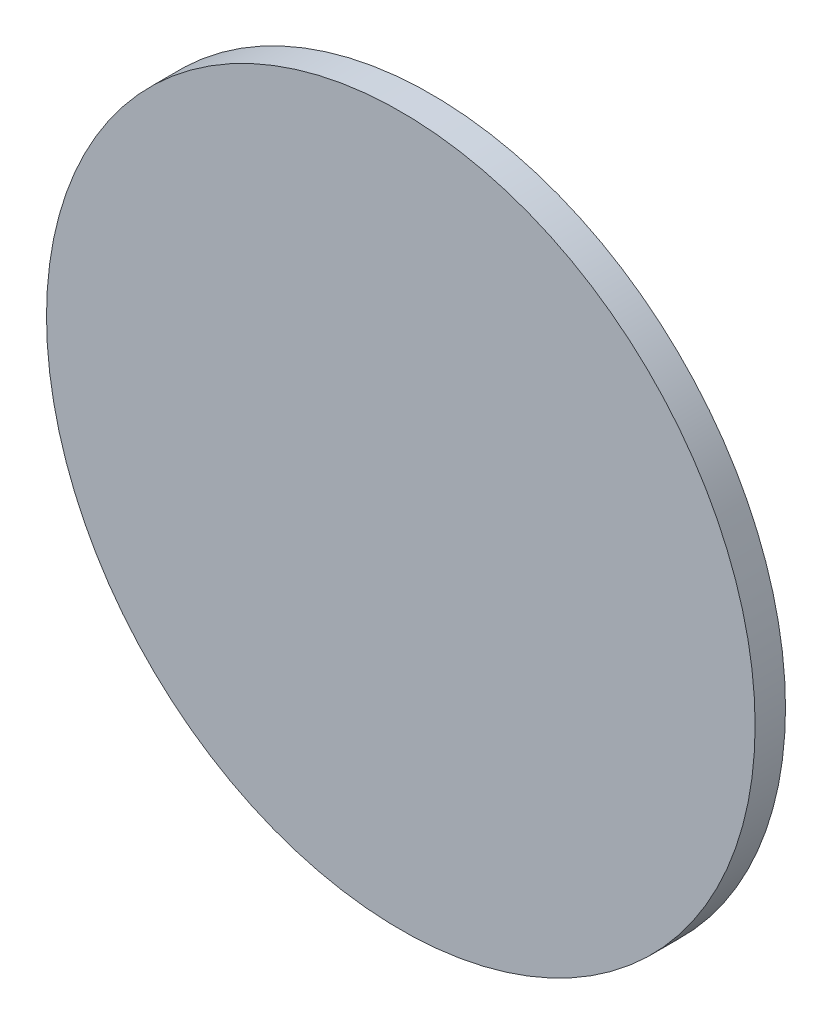
ISO-10303-21;
HEADER;
FILE_DESCRIPTION(('STEP AP214'),'2;1');
FILE_NAME('part.step','',(''),(''),'','','');
FILE_SCHEMA(('AUTOMOTIVE_DESIGN { 1 0 10303 214 1 1 1 1 }'));
ENDSEC;
DATA;
#1=APPLICATION_CONTEXT('core data for automotive mechanical design processes');
#2=APPLICATION_PROTOCOL_DEFINITION('international standard','automotive_design',2000,#1);
#3=PRODUCT_CONTEXT('',#1,'mechanical');
#4=PRODUCT('Part','Part','',(#3));
#5=PRODUCT_RELATED_PRODUCT_CATEGORY('part','',(#4));
#6=PRODUCT_DEFINITION_FORMATION('','',#4);
#7=PRODUCT_DEFINITION_CONTEXT('part definition',#1,'design');
#8=PRODUCT_DEFINITION('design','',#6,#7);
#9=PRODUCT_DEFINITION_SHAPE('','',#8);
#10=(LENGTH_UNIT() NAMED_UNIT(*) SI_UNIT(.MILLI.,.METRE.));
#11=(NAMED_UNIT(*) PLANE_ANGLE_UNIT() SI_UNIT($,.RADIAN.));
#12=(NAMED_UNIT(*) SI_UNIT($,.STERADIAN.) SOLID_ANGLE_UNIT());
#13=UNCERTAINTY_MEASURE_WITH_UNIT(LENGTH_MEASURE(1.E-05),#10,'distance_accuracy_value','');
#14=(GEOMETRIC_REPRESENTATION_CONTEXT(3) GLOBAL_UNCERTAINTY_ASSIGNED_CONTEXT((#13)) GLOBAL_UNIT_ASSIGNED_CONTEXT((#10,
#11,#12)) REPRESENTATION_CONTEXT('',''));
#15=CARTESIAN_POINT('',(0.,0.,0.));
#16=DIRECTION('',(0.,0.,1.));
#17=DIRECTION('',(1.,0.,0.));
#18=AXIS2_PLACEMENT_3D('',#15,#16,#17);
#19=CARTESIAN_POINT('',(0.,0.,3.81));
#20=DIRECTION('',(0.,0.,-1.));
#21=DIRECTION('',(-1.,0.,0.));
#22=AXIS2_PLACEMENT_3D('',#19,#20,#21);
#23=CYLINDRICAL_SURFACE('',#22,44.45);
#24=CARTESIAN_POINT('',(0.,0.,3.81));
#25=DIRECTION('',(0.,0.,1.));
#26=DIRECTION('',(1.,0.,0.));
#27=AXIS2_PLACEMENT_3D('',#24,#25,#26);
#28=CIRCLE('',#27,44.45);
#29=CARTESIAN_POINT('',(-44.45,0.,3.81));
#30=VERTEX_POINT('',#29);
#31=EDGE_CURVE('E10',#30,#30,#28,.T.);
#32=CARTESIAN_POINT('',(0.,0.,0.));
#33=DIRECTION('',(0.,0.,1.));
#34=DIRECTION('',(1.,0.,0.));
#35=AXIS2_PLACEMENT_3D('',#32,#33,#34);
#36=CIRCLE('',#35,44.45);
#37=CARTESIAN_POINT('',(-44.45,0.,0.));
#38=VERTEX_POINT('',#37);
#39=EDGE_CURVE('E36',#38,#38,#36,.T.);
#40=CARTESIAN_POINT('',(-44.45,0.,3.81));
#41=CARTESIAN_POINT('',(-44.45,0.,3.7703125));
#42=CARTESIAN_POINT('',(-44.45,0.,3.730625));
#43=CARTESIAN_POINT('',(-44.45,0.,3.65125));
#44=CARTESIAN_POINT('',(-44.45,0.,3.6115625));
#45=CARTESIAN_POINT('',(-44.45,0.,3.5321875));
#46=CARTESIAN_POINT('',(-44.45,0.,3.4925));
#47=CARTESIAN_POINT('',(-44.45,0.,3.413125));
#48=CARTESIAN_POINT('',(-44.45,0.,3.3734375));
#49=CARTESIAN_POINT('',(-44.45,0.,3.2940625));
#50=CARTESIAN_POINT('',(-44.45,0.,3.254375));
#51=CARTESIAN_POINT('',(-44.45,0.,3.175));
#52=CARTESIAN_POINT('',(-44.45,0.,3.1353125));
#53=CARTESIAN_POINT('',(-44.45,0.,3.0559375));
#54=CARTESIAN_POINT('',(-44.45,0.,3.01625));
#55=CARTESIAN_POINT('',(-44.45,0.,2.936875));
#56=CARTESIAN_POINT('',(-44.45,0.,2.8971875));
#57=CARTESIAN_POINT('',(-44.45,0.,2.8178125));
#58=CARTESIAN_POINT('',(-44.45,0.,2.778125));
#59=CARTESIAN_POINT('',(-44.45,0.,2.69875));
#60=CARTESIAN_POINT('',(-44.45,0.,2.6590625));
#61=CARTESIAN_POINT('',(-44.45,0.,2.5796875));
#62=CARTESIAN_POINT('',(-44.45,0.,2.54));
#63=CARTESIAN_POINT('',(-44.45,0.,2.460625));
#64=CARTESIAN_POINT('',(-44.45,0.,2.4209375));
#65=CARTESIAN_POINT('',(-44.45,0.,2.3415625));
#66=CARTESIAN_POINT('',(-44.45,0.,2.301875));
#67=CARTESIAN_POINT('',(-44.45,0.,2.2225));
#68=CARTESIAN_POINT('',(-44.45,0.,2.1828125));
#69=CARTESIAN_POINT('',(-44.45,0.,2.1034375));
#70=CARTESIAN_POINT('',(-44.45,0.,2.06375));
#71=CARTESIAN_POINT('',(-44.45,0.,1.984375));
#72=CARTESIAN_POINT('',(-44.45,0.,1.9446875));
#73=CARTESIAN_POINT('',(-44.45,0.,1.8653125));
#74=CARTESIAN_POINT('',(-44.45,0.,1.825625));
#75=CARTESIAN_POINT('',(-44.45,0.,1.74625));
#76=CARTESIAN_POINT('',(-44.45,0.,1.7065625));
#77=CARTESIAN_POINT('',(-44.45,0.,1.6271875));
#78=CARTESIAN_POINT('',(-44.45,0.,1.5875));
#79=CARTESIAN_POINT('',(-44.45,0.,1.508125));
#80=CARTESIAN_POINT('',(-44.45,0.,1.4684375));
#81=CARTESIAN_POINT('',(-44.45,0.,1.3890625));
#82=CARTESIAN_POINT('',(-44.45,0.,1.349375));
#83=CARTESIAN_POINT('',(-44.45,0.,1.27));
#84=CARTESIAN_POINT('',(-44.45,0.,1.2303125));
#85=CARTESIAN_POINT('',(-44.45,0.,1.1509375));
#86=CARTESIAN_POINT('',(-44.45,0.,1.11125));
#87=CARTESIAN_POINT('',(-44.45,0.,1.031875));
#88=CARTESIAN_POINT('',(-44.45,0.,0.9921875));
#89=CARTESIAN_POINT('',(-44.45,0.,0.9128125));
#90=CARTESIAN_POINT('',(-44.45,0.,0.873125));
#91=CARTESIAN_POINT('',(-44.45,0.,0.79375));
#92=CARTESIAN_POINT('',(-44.45,0.,0.7540625));
#93=CARTESIAN_POINT('',(-44.45,0.,0.6746875));
#94=CARTESIAN_POINT('',(-44.45,0.,0.635));
#95=CARTESIAN_POINT('',(-44.45,0.,0.555625));
#96=CARTESIAN_POINT('',(-44.45,0.,0.5159375));
#97=CARTESIAN_POINT('',(-44.45,0.,0.4365625));
#98=CARTESIAN_POINT('',(-44.45,0.,0.396875));
#99=CARTESIAN_POINT('',(-44.45,0.,0.3175));
#100=CARTESIAN_POINT('',(-44.45,0.,0.2778125));
#101=CARTESIAN_POINT('',(-44.45,0.,0.1984375));
#102=CARTESIAN_POINT('',(-44.45,0.,0.15875));
#103=CARTESIAN_POINT('',(-44.45,0.,0.0793749999999999));
#104=CARTESIAN_POINT('',(-44.45,0.,0.0396874999999999));
#105=CARTESIAN_POINT('',(-44.45,0.,0.));
#106=B_SPLINE_CURVE_WITH_KNOTS('',3,(#40,#41,#42,#43,#44,#45,#46,#47,#48,#49,#50,#51,#52,#53,
#54,#55,#56,#57,#58,#59,#60,#61,#62,#63,#64,#65,#66,#67,#68,#69,#70,#71,#72,#73,#74,#75,#76,#77,
#78,#79,#80,#81,#82,#83,#84,#85,#86,#87,#88,#89,#90,#91,#92,#93,#94,#95,#96,#97,#98,#99,#100,
#101,#102,#103,#104,#105),.UNSPECIFIED.,.F.,.F.,(4,2,2,2,2,2,2,2,2,2,2,2,2,2,2,2,2,2,2,2,2,2,2,
2,2,2,2,2,2,2,2,2,4),(0.,0.1190625,0.238125,0.3571875,0.47625,0.5953125,0.714375,0.8334375,
0.9525,1.0715625,1.190625,1.3096875,1.42875,1.5478125,1.666875,1.7859375,1.905,2.0240625,
2.143125,2.2621875,2.38125,2.5003125,2.619375,2.7384375,2.8575,2.9765625,3.095625,3.2146875,
3.33375,3.4528125,3.571875,3.6909375,3.81),.UNSPECIFIED.);
#107=EDGE_CURVE('BSEAM33',#30,#38,#106,.T.);
#108=ORIENTED_EDGE('',*,*,#31,.F.);
#109=ORIENTED_EDGE('',*,*,#39,.T.);
#110=ORIENTED_EDGE('',*,*,#107,.T.);
#111=ORIENTED_EDGE('',*,*,#107,.F.);
#112=EDGE_LOOP('',(#108,#110,#109,#111));
#113=FACE_BOUND('',#112,.T.);
#114=ADVANCED_FACE('F33',(#113),#23,.T.);
#115=CARTESIAN_POINT('',(0.,0.,3.81));
#116=DIRECTION('',(0.,0.,1.));
#117=DIRECTION('',(1.,0.,0.));
#118=AXIS2_PLACEMENT_3D('',#115,#116,#117);
#119=PLANE('',#118);
#120=ORIENTED_EDGE('',*,*,#31,.T.);
#121=EDGE_LOOP('',(#120));
#122=FACE_BOUND('',#121,.T.);
#123=ADVANCED_FACE('F48',(#122),#119,.T.);
#124=CARTESIAN_POINT('',(0.,0.,0.));
#125=DIRECTION('',(0.,0.,1.));
#126=DIRECTION('',(1.,0.,0.));
#127=AXIS2_PLACEMENT_3D('',#124,#125,#126);
#128=PLANE('',#127);
#129=ORIENTED_EDGE('',*,*,#39,.F.);
#130=EDGE_LOOP('',(#129));
#131=FACE_BOUND('',#130,.T.);
#132=ADVANCED_FACE('F46',(#131),#128,.F.);
#133=CLOSED_SHELL('',(#114,#123,#132));
#134=MANIFOLD_SOLID_BREP('B2',#133);
#135=ADVANCED_BREP_SHAPE_REPRESENTATION('',(#18,#134),#14);
#136=SHAPE_DEFINITION_REPRESENTATION(#9,#135);
ENDSEC;
END-ISO-10303-21;
